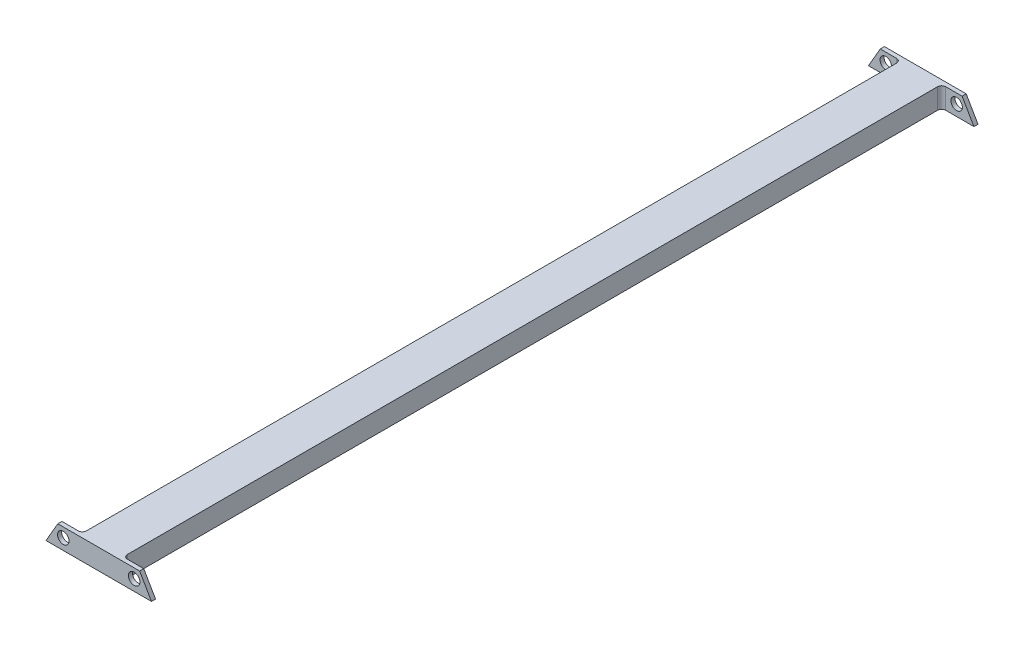
ISO-10303-21;
HEADER;
FILE_DESCRIPTION(('STEP AP214'),'2;1');
FILE_NAME('part.step','',(''),(''),'','','');
FILE_SCHEMA(('AUTOMOTIVE_DESIGN { 1 0 10303 214 1 1 1 1 }'));
ENDSEC;
DATA;
#1=APPLICATION_CONTEXT('core data for automotive mechanical design processes');
#2=APPLICATION_PROTOCOL_DEFINITION('international standard','automotive_design',2000,#1);
#3=PRODUCT_CONTEXT('',#1,'mechanical');
#4=PRODUCT('Part','Part','',(#3));
#5=PRODUCT_RELATED_PRODUCT_CATEGORY('part','',(#4));
#6=PRODUCT_DEFINITION_FORMATION('','',#4);
#7=PRODUCT_DEFINITION_CONTEXT('part definition',#1,'design');
#8=PRODUCT_DEFINITION('design','',#6,#7);
#9=PRODUCT_DEFINITION_SHAPE('','',#8);
#10=(LENGTH_UNIT() NAMED_UNIT(*) SI_UNIT(.MILLI.,.METRE.));
#11=(NAMED_UNIT(*) PLANE_ANGLE_UNIT() SI_UNIT($,.RADIAN.));
#12=(NAMED_UNIT(*) SI_UNIT($,.STERADIAN.) SOLID_ANGLE_UNIT());
#13=UNCERTAINTY_MEASURE_WITH_UNIT(LENGTH_MEASURE(1.E-05),#10,'distance_accuracy_value','');
#14=(GEOMETRIC_REPRESENTATION_CONTEXT(3) GLOBAL_UNCERTAINTY_ASSIGNED_CONTEXT((#13)) GLOBAL_UNIT_ASSIGNED_CONTEXT((#10,
#11,#12)) REPRESENTATION_CONTEXT('',''));
#15=CARTESIAN_POINT('',(0.,0.,0.));
#16=DIRECTION('',(0.,0.,1.));
#17=DIRECTION('',(1.,0.,0.));
#18=AXIS2_PLACEMENT_3D('',#15,#16,#17);
#19=CARTESIAN_POINT('',(0.,0.,5.));
#20=DIRECTION('',(0.,0.,-1.));
#21=DIRECTION('',(-1.,0.,0.));
#22=AXIS2_PLACEMENT_3D('',#19,#20,#21);
#23=PLANE('',#22);
#24=CARTESIAN_POINT('',(93.3012701892223,-11.6025403784439,5.));
#25=DIRECTION('',(0.,0.,1.));
#26=DIRECTION('',(1.,0.,0.));
#27=AXIS2_PLACEMENT_3D('',#24,#25,#26);
#28=CIRCLE('',#27,7.);
#29=CARTESIAN_POINT('',(100.301270189222,-11.6025403784439,5.));
#30=VERTEX_POINT('',#29);
#31=EDGE_CURVE('E188',#30,#30,#28,.T.);
#32=ORIENTED_EDGE('',*,*,#31,.F.);
#33=EDGE_LOOP('',(#32));
#34=FACE_BOUND('',#33,.T.);
#35=DIRECTION('',(-1.,0.,0.));
#36=VECTOR('',#35,1.);
#37=CARTESIAN_POINT('',(0.,0.,5.));
#38=LINE('',#37,#36);
#39=CARTESIAN_POINT('',(100.,0.,5.));
#40=VERTEX_POINT('',#39);
#41=CARTESIAN_POINT('',(80.,0.,5.));
#42=VERTEX_POINT('',#41);
#43=EDGE_CURVE('E205',#40,#42,#38,.T.);
#44=ORIENTED_EDGE('',*,*,#43,.T.);
#45=DIRECTION('',(0.,1.,0.));
#46=VECTOR('',#45,1.);
#47=CARTESIAN_POINT('',(80.,-25.,5.));
#48=LINE('',#47,#46);
#49=CARTESIAN_POINT('',(80.,-25.,5.));
#50=VERTEX_POINT('',#49);
#51=EDGE_CURVE('E240',#42,#50,#48,.F.);
#52=ORIENTED_EDGE('',*,*,#51,.T.);
#53=DIRECTION('',(1.,0.,0.));
#54=VECTOR('',#53,1.);
#55=CARTESIAN_POINT('',(114.433756729741,-25.,5.));
#56=LINE('',#55,#54);
#57=CARTESIAN_POINT('',(114.433756729741,-25.,5.));
#58=VERTEX_POINT('',#57);
#59=EDGE_CURVE('E197',#50,#58,#56,.T.);
#60=ORIENTED_EDGE('',*,*,#59,.T.);
#61=DIRECTION('',(-0.500000000000005,0.866025403784436,0.));
#62=VECTOR('',#61,1.);
#63=CARTESIAN_POINT('',(100.,0.,5.));
#64=LINE('',#63,#62);
#65=EDGE_CURVE('E202',#58,#40,#64,.T.);
#66=ORIENTED_EDGE('',*,*,#65,.T.);
#67=EDGE_LOOP('',(#44,#52,#60,#66));
#68=FACE_BOUND('',#67,.T.);
#69=ADVANCED_FACE('F32',(#34,#68),#23,.F.);
#70=CARTESIAN_POINT('',(6.69872981077774,-11.602540378444,5.));
#71=DIRECTION('',(0.,0.,1.));
#72=DIRECTION('',(1.,0.,0.));
#73=AXIS2_PLACEMENT_3D('',#70,#71,#72);
#74=CIRCLE('',#73,7.00000000000001);
#75=CARTESIAN_POINT('',(13.6987298107777,-11.602540378444,5.));
#76=VERTEX_POINT('',#75);
#77=EDGE_CURVE('E182',#76,#76,#74,.T.);
#78=ORIENTED_EDGE('',*,*,#77,.F.);
#79=EDGE_LOOP('',(#78));
#80=FACE_BOUND('',#79,.T.);
#81=CARTESIAN_POINT('',(-14.4337567297408,-25.,5.));
#82=VERTEX_POINT('',#81);
#83=CARTESIAN_POINT('',(20.,-25.,5.));
#84=VERTEX_POINT('',#83);
#85=EDGE_CURVE('E199',#82,#84,#56,.T.);
#86=ORIENTED_EDGE('',*,*,#85,.T.);
#87=DIRECTION('',(0.,-1.,0.));
#88=VECTOR('',#87,1.);
#89=CARTESIAN_POINT('',(20.,0.,5.));
#90=LINE('',#89,#88);
#91=CARTESIAN_POINT('',(20.,0.,5.));
#92=VERTEX_POINT('',#91);
#93=EDGE_CURVE('E230',#84,#92,#90,.F.);
#94=ORIENTED_EDGE('',*,*,#93,.T.);
#95=CARTESIAN_POINT('',(0.,0.,5.));
#96=VERTEX_POINT('',#95);
#97=EDGE_CURVE('E204',#92,#96,#38,.T.);
#98=ORIENTED_EDGE('',*,*,#97,.T.);
#99=DIRECTION('',(-0.500000000000004,-0.866025403784436,0.));
#100=VECTOR('',#99,1.);
#101=CARTESIAN_POINT('',(-14.4337567297408,-25.,5.));
#102=LINE('',#101,#100);
#103=EDGE_CURVE('E194',#96,#82,#102,.T.);
#104=ORIENTED_EDGE('',*,*,#103,.T.);
#105=EDGE_LOOP('',(#86,#94,#98,#104));
#106=FACE_BOUND('',#105,.T.);
#107=ADVANCED_FACE('F336',(#80,#106),#23,.F.);
#108=CARTESIAN_POINT('',(0.,0.,0.));
#109=DIRECTION('',(0.,0.,-1.));
#110=DIRECTION('',(-1.,0.,0.));
#111=AXIS2_PLACEMENT_3D('',#108,#109,#110);
#112=PLANE('',#111);
#113=CARTESIAN_POINT('',(93.3012701892223,-11.6025403784439,0.));
#114=DIRECTION('',(0.,0.,1.));
#115=DIRECTION('',(1.,0.,0.));
#116=AXIS2_PLACEMENT_3D('',#113,#114,#115);
#117=CIRCLE('',#116,7.);
#118=CARTESIAN_POINT('',(100.301270189222,-11.6025403784439,0.));
#119=VERTEX_POINT('',#118);
#120=EDGE_CURVE('E185',#119,#119,#117,.T.);
#121=ORIENTED_EDGE('',*,*,#120,.T.);
#122=EDGE_LOOP('',(#121));
#123=FACE_BOUND('',#122,.T.);
#124=DIRECTION('',(-0.500000000000004,-0.866025403784436,0.));
#125=VECTOR('',#124,1.);
#126=CARTESIAN_POINT('',(-14.4337567297408,-25.,0.));
#127=LINE('',#126,#125);
#128=CARTESIAN_POINT('',(0.,0.,0.));
#129=VERTEX_POINT('',#128);
#130=CARTESIAN_POINT('',(-14.4337567297408,-25.,0.));
#131=VERTEX_POINT('',#130);
#132=EDGE_CURVE('E191',#129,#131,#127,.T.);
#133=ORIENTED_EDGE('',*,*,#132,.F.);
#134=DIRECTION('',(-1.,0.,0.));
#135=VECTOR('',#134,1.);
#136=CARTESIAN_POINT('',(0.,0.,0.));
#137=LINE('',#136,#135);
#138=CARTESIAN_POINT('',(100.,0.,0.));
#139=VERTEX_POINT('',#138);
#140=EDGE_CURVE('E198',#139,#129,#137,.T.);
#141=ORIENTED_EDGE('',*,*,#140,.F.);
#142=DIRECTION('',(-0.500000000000005,0.866025403784436,0.));
#143=VECTOR('',#142,1.);
#144=CARTESIAN_POINT('',(100.,0.,0.));
#145=LINE('',#144,#143);
#146=CARTESIAN_POINT('',(114.433756729741,-25.,0.));
#147=VERTEX_POINT('',#146);
#148=EDGE_CURVE('E213',#147,#139,#145,.T.);
#149=ORIENTED_EDGE('',*,*,#148,.F.);
#150=DIRECTION('',(1.,0.,0.));
#151=VECTOR('',#150,1.);
#152=CARTESIAN_POINT('',(114.433756729741,-25.,0.));
#153=LINE('',#152,#151);
#154=EDGE_CURVE('E211',#131,#147,#153,.T.);
#155=ORIENTED_EDGE('',*,*,#154,.F.);
#156=EDGE_LOOP('',(#133,#141,#149,#155));
#157=FACE_BOUND('',#156,.T.);
#158=CARTESIAN_POINT('',(6.69872981077774,-11.602540378444,0.));
#159=DIRECTION('',(0.,0.,1.));
#160=DIRECTION('',(1.,0.,0.));
#161=AXIS2_PLACEMENT_3D('',#158,#159,#160);
#162=CIRCLE('',#161,7.00000000000001);
#163=CARTESIAN_POINT('',(13.6987298107777,-11.602540378444,0.));
#164=VERTEX_POINT('',#163);
#165=EDGE_CURVE('E181',#164,#164,#162,.T.);
#166=ORIENTED_EDGE('',*,*,#165,.T.);
#167=EDGE_LOOP('',(#166));
#168=FACE_BOUND('',#167,.T.);
#169=ADVANCED_FACE('F316',(#123,#157,#168),#112,.T.);
#170=CARTESIAN_POINT('',(-14.4337567297408,-25.,5.));
#171=DIRECTION('',(0.866025403784436,-0.500000000000004,0.));
#172=DIRECTION('',(0.500000000000004,0.866025403784437,0.));
#173=AXIS2_PLACEMENT_3D('',#170,#171,#172);
#174=PLANE('',#173);
#175=ORIENTED_EDGE('',*,*,#132,.T.);
#176=DIRECTION('',(0.,0.,-1.));
#177=VECTOR('',#176,1.);
#178=CARTESIAN_POINT('',(-14.4337567297408,-25.,5.));
#179=LINE('',#178,#177);
#180=EDGE_CURVE('E224',#82,#131,#179,.T.);
#181=ORIENTED_EDGE('',*,*,#180,.F.);
#182=ORIENTED_EDGE('',*,*,#103,.F.);
#183=DIRECTION('',(0.,0.,-1.));
#184=VECTOR('',#183,1.);
#185=CARTESIAN_POINT('',(0.,0.,5.));
#186=LINE('',#185,#184);
#187=EDGE_CURVE('E208',#96,#129,#186,.T.);
#188=ORIENTED_EDGE('',*,*,#187,.T.);
#189=EDGE_LOOP('',(#175,#181,#182,#188));
#190=FACE_BOUND('',#189,.T.);
#191=ADVANCED_FACE('F320',(#190),#174,.F.);
#192=CARTESIAN_POINT('',(114.433756729741,-25.,5.));
#193=DIRECTION('',(0.,1.,0.));
#194=DIRECTION('',(-1.,0.,0.));
#195=AXIS2_PLACEMENT_3D('',#192,#193,#194);
#196=PLANE('',#195);
#197=ORIENTED_EDGE('',*,*,#154,.T.);
#198=DIRECTION('',(0.,0.,-1.));
#199=VECTOR('',#198,1.);
#200=CARTESIAN_POINT('',(114.433756729741,-25.,5.));
#201=LINE('',#200,#199);
#202=EDGE_CURVE('E221',#58,#147,#201,.T.);
#203=ORIENTED_EDGE('',*,*,#202,.F.);
#204=ORIENTED_EDGE('',*,*,#59,.F.);
#205=CARTESIAN_POINT('',(80.,-25.,10.));
#206=DIRECTION('',(0.,1.,0.));
#207=DIRECTION('',(-1.,0.,0.));
#208=AXIS2_PLACEMENT_3D('',#205,#206,#207);
#209=CIRCLE('',#208,5.);
#210=CARTESIAN_POINT('',(75.,-25.,10.));
#211=VERTEX_POINT('',#210);
#212=EDGE_CURVE('E244',#50,#211,#209,.T.);
#213=ORIENTED_EDGE('',*,*,#212,.T.);
#214=DIRECTION('',(0.,0.,-1.));
#215=VECTOR('',#214,1.);
#216=CARTESIAN_POINT('',(75.,-25.,1005.));
#217=LINE('',#216,#215);
#218=CARTESIAN_POINT('',(75.,-25.,1000.));
#219=VERTEX_POINT('',#218);
#220=EDGE_CURVE('E168',#219,#211,#217,.T.);
#221=ORIENTED_EDGE('',*,*,#220,.F.);
#222=CARTESIAN_POINT('',(80.,-25.,1000.));
#223=DIRECTION('',(0.,1.,0.));
#224=DIRECTION('',(-1.,0.,0.));
#225=AXIS2_PLACEMENT_3D('',#222,#223,#224);
#226=CIRCLE('',#225,5.);
#227=CARTESIAN_POINT('',(80.,-25.,1005.));
#228=VERTEX_POINT('',#227);
#229=EDGE_CURVE('E254',#219,#228,#226,.T.);
#230=ORIENTED_EDGE('',*,*,#229,.T.);
#231=DIRECTION('',(1.,0.,0.));
#232=VECTOR('',#231,1.);
#233=CARTESIAN_POINT('',(75.,-25.,1005.));
#234=LINE('',#233,#232);
#235=CARTESIAN_POINT('',(114.433756729741,-25.,1005.));
#236=VERTEX_POINT('',#235);
#237=EDGE_CURVE('E268',#228,#236,#234,.T.);
#238=ORIENTED_EDGE('',*,*,#237,.T.);
#239=DIRECTION('',(0.,0.,-1.));
#240=VECTOR('',#239,1.);
#241=CARTESIAN_POINT('',(114.433756729741,-25.,1010.));
#242=LINE('',#241,#240);
#243=CARTESIAN_POINT('',(114.433756729741,-25.,1010.));
#244=VERTEX_POINT('',#243);
#245=EDGE_CURVE('E149',#244,#236,#242,.T.);
#246=ORIENTED_EDGE('',*,*,#245,.F.);
#247=DIRECTION('',(1.,0.,0.));
#248=VECTOR('',#247,1.);
#249=CARTESIAN_POINT('',(-14.4337567297408,-25.,1010.));
#250=LINE('',#249,#248);
#251=CARTESIAN_POINT('',(-14.4337567297408,-25.,1010.));
#252=VERTEX_POINT('',#251);
#253=EDGE_CURVE('E142',#252,#244,#250,.T.);
#254=ORIENTED_EDGE('',*,*,#253,.F.);
#255=DIRECTION('',(0.,0.,-1.));
#256=VECTOR('',#255,1.);
#257=CARTESIAN_POINT('',(-14.4337567297408,-25.,1010.));
#258=LINE('',#257,#256);
#259=CARTESIAN_POINT('',(-14.4337567297408,-25.,1005.));
#260=VERTEX_POINT('',#259);
#261=EDGE_CURVE('E146',#252,#260,#258,.T.);
#262=ORIENTED_EDGE('',*,*,#261,.T.);
#263=CARTESIAN_POINT('',(20.,-25.,1005.));
#264=VERTEX_POINT('',#263);
#265=EDGE_CURVE('E263',#260,#264,#234,.T.);
#266=ORIENTED_EDGE('',*,*,#265,.T.);
#267=CARTESIAN_POINT('',(20.,-25.,1000.));
#268=DIRECTION('',(0.,1.,0.));
#269=DIRECTION('',(-1.,0.,0.));
#270=AXIS2_PLACEMENT_3D('',#267,#268,#269);
#271=CIRCLE('',#270,5.);
#272=CARTESIAN_POINT('',(25.,-25.,1000.));
#273=VERTEX_POINT('',#272);
#274=EDGE_CURVE('E40',#264,#273,#271,.T.);
#275=ORIENTED_EDGE('',*,*,#274,.T.);
#276=DIRECTION('',(0.,0.,-1.));
#277=VECTOR('',#276,1.);
#278=CARTESIAN_POINT('',(25.,-25.,1005.));
#279=LINE('',#278,#277);
#280=CARTESIAN_POINT('',(25.,-25.,10.));
#281=VERTEX_POINT('',#280);
#282=EDGE_CURVE('E170',#273,#281,#279,.T.);
#283=ORIENTED_EDGE('',*,*,#282,.T.);
#284=CARTESIAN_POINT('',(20.,-25.,10.));
#285=DIRECTION('',(0.,1.,0.));
#286=DIRECTION('',(-1.,0.,0.));
#287=AXIS2_PLACEMENT_3D('',#284,#285,#286);
#288=CIRCLE('',#287,5.);
#289=EDGE_CURVE('E232',#281,#84,#288,.T.);
#290=ORIENTED_EDGE('',*,*,#289,.T.);
#291=ORIENTED_EDGE('',*,*,#85,.F.);
#292=ORIENTED_EDGE('',*,*,#180,.T.);
#293=EDGE_LOOP('',(#197,#203,#204,#213,#221,#230,#238,#246,#254,#262,#266,#275,#283,#290,#291,#292));
#294=FACE_BOUND('',#293,.T.);
#295=ADVANCED_FACE('F144',(#294),#196,.F.);
#296=CARTESIAN_POINT('',(100.,0.,5.));
#297=DIRECTION('',(-0.866025403784436,-0.500000000000005,0.));
#298=DIRECTION('',(0.500000000000005,-0.866025403784436,0.));
#299=AXIS2_PLACEMENT_3D('',#296,#297,#298);
#300=PLANE('',#299);
#301=ORIENTED_EDGE('',*,*,#148,.T.);
#302=DIRECTION('',(0.,0.,-1.));
#303=VECTOR('',#302,1.);
#304=CARTESIAN_POINT('',(100.,0.,5.));
#305=LINE('',#304,#303);
#306=EDGE_CURVE('E218',#40,#139,#305,.T.);
#307=ORIENTED_EDGE('',*,*,#306,.F.);
#308=ORIENTED_EDGE('',*,*,#65,.F.);
#309=ORIENTED_EDGE('',*,*,#202,.T.);
#310=EDGE_LOOP('',(#301,#307,#308,#309));
#311=FACE_BOUND('',#310,.T.);
#312=ADVANCED_FACE('F310',(#311),#300,.F.);
#313=CARTESIAN_POINT('',(0.,0.,5.));
#314=DIRECTION('',(0.,-1.,0.));
#315=DIRECTION('',(0.,0.,-1.));
#316=AXIS2_PLACEMENT_3D('',#313,#314,#315);
#317=PLANE('',#316);
#318=ORIENTED_EDGE('',*,*,#140,.T.);
#319=ORIENTED_EDGE('',*,*,#187,.F.);
#320=ORIENTED_EDGE('',*,*,#97,.F.);
#321=CARTESIAN_POINT('',(20.,0.,10.));
#322=DIRECTION('',(0.,-1.,0.));
#323=DIRECTION('',(0.,0.,-1.));
#324=AXIS2_PLACEMENT_3D('',#321,#322,#323);
#325=CIRCLE('',#324,5.);
#326=CARTESIAN_POINT('',(25.,0.,10.));
#327=VERTEX_POINT('',#326);
#328=EDGE_CURVE('E234',#92,#327,#325,.T.);
#329=ORIENTED_EDGE('',*,*,#328,.T.);
#330=DIRECTION('',(0.,0.,-1.));
#331=VECTOR('',#330,1.);
#332=CARTESIAN_POINT('',(25.,0.,1005.));
#333=LINE('',#332,#331);
#334=CARTESIAN_POINT('',(25.,0.,1000.));
#335=VERTEX_POINT('',#334);
#336=EDGE_CURVE('E177',#335,#327,#333,.T.);
#337=ORIENTED_EDGE('',*,*,#336,.F.);
#338=CARTESIAN_POINT('',(20.,0.,1000.));
#339=DIRECTION('',(0.,-1.,0.));
#340=DIRECTION('',(0.,0.,-1.));
#341=AXIS2_PLACEMENT_3D('',#338,#339,#340);
#342=CIRCLE('',#341,5.);
#343=CARTESIAN_POINT('',(20.,0.,1005.));
#344=VERTEX_POINT('',#343);
#345=EDGE_CURVE('E11',#335,#344,#342,.T.);
#346=ORIENTED_EDGE('',*,*,#345,.T.);
#347=DIRECTION('',(-1.,0.,0.));
#348=VECTOR('',#347,1.);
#349=CARTESIAN_POINT('',(25.,0.,1005.));
#350=LINE('',#349,#348);
#351=CARTESIAN_POINT('',(0.,0.,1005.));
#352=VERTEX_POINT('',#351);
#353=EDGE_CURVE('E264',#344,#352,#350,.T.);
#354=ORIENTED_EDGE('',*,*,#353,.T.);
#355=DIRECTION('',(0.,0.,-1.));
#356=VECTOR('',#355,1.);
#357=CARTESIAN_POINT('',(0.,0.,1010.));
#358=LINE('',#357,#356);
#359=CARTESIAN_POINT('',(0.,0.,1010.));
#360=VERTEX_POINT('',#359);
#361=EDGE_CURVE('E277',#360,#352,#358,.T.);
#362=ORIENTED_EDGE('',*,*,#361,.F.);
#363=DIRECTION('',(-1.,0.,0.));
#364=VECTOR('',#363,1.);
#365=CARTESIAN_POINT('',(100.,0.,1010.));
#366=LINE('',#365,#364);
#367=CARTESIAN_POINT('',(100.,0.,1010.));
#368=VERTEX_POINT('',#367);
#369=EDGE_CURVE('E159',#368,#360,#366,.T.);
#370=ORIENTED_EDGE('',*,*,#369,.F.);
#371=DIRECTION('',(0.,0.,-1.));
#372=VECTOR('',#371,1.);
#373=CARTESIAN_POINT('',(100.,0.,1010.));
#374=LINE('',#373,#372);
#375=CARTESIAN_POINT('',(100.,0.,1005.));
#376=VERTEX_POINT('',#375);
#377=EDGE_CURVE('E172',#368,#376,#374,.T.);
#378=ORIENTED_EDGE('',*,*,#377,.T.);
#379=CARTESIAN_POINT('',(80.,0.,1005.));
#380=VERTEX_POINT('',#379);
#381=EDGE_CURVE('E163',#376,#380,#350,.T.);
#382=ORIENTED_EDGE('',*,*,#381,.T.);
#383=CARTESIAN_POINT('',(80.,0.,1000.));
#384=DIRECTION('',(0.,-1.,0.));
#385=DIRECTION('',(0.,0.,-1.));
#386=AXIS2_PLACEMENT_3D('',#383,#384,#385);
#387=CIRCLE('',#386,5.);
#388=CARTESIAN_POINT('',(75.,0.,1000.));
#389=VERTEX_POINT('',#388);
#390=EDGE_CURVE('E252',#380,#389,#387,.T.);
#391=ORIENTED_EDGE('',*,*,#390,.T.);
#392=DIRECTION('',(0.,0.,-1.));
#393=VECTOR('',#392,1.);
#394=CARTESIAN_POINT('',(75.,0.,1005.));
#395=LINE('',#394,#393);
#396=CARTESIAN_POINT('',(75.,0.,10.));
#397=VERTEX_POINT('',#396);
#398=EDGE_CURVE('E179',#389,#397,#395,.T.);
#399=ORIENTED_EDGE('',*,*,#398,.T.);
#400=CARTESIAN_POINT('',(80.,0.,10.));
#401=DIRECTION('',(0.,-1.,0.));
#402=DIRECTION('',(0.,0.,-1.));
#403=AXIS2_PLACEMENT_3D('',#400,#401,#402);
#404=CIRCLE('',#403,5.);
#405=EDGE_CURVE('E242',#397,#42,#404,.T.);
#406=ORIENTED_EDGE('',*,*,#405,.T.);
#407=ORIENTED_EDGE('',*,*,#43,.F.);
#408=ORIENTED_EDGE('',*,*,#306,.T.);
#409=EDGE_LOOP('',(#318,#319,#320,#329,#337,#346,#354,#362,#370,#378,#382,#391,#399,#406,#407,#408));
#410=FACE_BOUND('',#409,.T.);
#411=ADVANCED_FACE('F281',(#410),#317,.F.);
#412=CARTESIAN_POINT('',(93.3012701892223,-11.6025403784439,5.));
#413=DIRECTION('',(0.,0.,-1.));
#414=DIRECTION('',(-1.,0.,0.));
#415=AXIS2_PLACEMENT_3D('',#412,#413,#414);
#416=CYLINDRICAL_SURFACE('',#415,7.);
#417=ORIENTED_EDGE('',*,*,#31,.T.);
#418=EDGE_LOOP('',(#417));
#419=FACE_BOUND('',#418,.T.);
#420=ORIENTED_EDGE('',*,*,#120,.F.);
#421=EDGE_LOOP('',(#420));
#422=FACE_BOUND('',#421,.T.);
#423=ADVANCED_FACE('F346',(#419,#422),#416,.F.);
#424=CARTESIAN_POINT('',(6.69872981077774,-11.602540378444,5.));
#425=DIRECTION('',(0.,0.,-1.));
#426=DIRECTION('',(-1.,0.,0.));
#427=AXIS2_PLACEMENT_3D('',#424,#425,#426);
#428=CYLINDRICAL_SURFACE('',#427,7.00000000000001);
#429=ORIENTED_EDGE('',*,*,#77,.T.);
#430=EDGE_LOOP('',(#429));
#431=FACE_BOUND('',#430,.T.);
#432=ORIENTED_EDGE('',*,*,#165,.F.);
#433=EDGE_LOOP('',(#432));
#434=FACE_BOUND('',#433,.T.);
#435=ADVANCED_FACE('F494',(#431,#434),#428,.F.);
#436=CARTESIAN_POINT('',(75.,-25.,1005.));
#437=DIRECTION('',(-1.,0.,0.));
#438=DIRECTION('',(0.,0.,1.));
#439=AXIS2_PLACEMENT_3D('',#436,#437,#438);
#440=PLANE('',#439);
#441=ORIENTED_EDGE('',*,*,#398,.F.);
#442=DIRECTION('',(0.,1.,0.));
#443=VECTOR('',#442,1.);
#444=CARTESIAN_POINT('',(75.,-25.,1000.));
#445=LINE('',#444,#443);
#446=EDGE_CURVE('E250',#389,#219,#445,.F.);
#447=ORIENTED_EDGE('',*,*,#446,.T.);
#448=ORIENTED_EDGE('',*,*,#220,.T.);
#449=DIRECTION('',(0.,1.,0.));
#450=VECTOR('',#449,1.);
#451=CARTESIAN_POINT('',(75.,0.,10.));
#452=LINE('',#451,#450);
#453=EDGE_CURVE('E237',#211,#397,#452,.T.);
#454=ORIENTED_EDGE('',*,*,#453,.T.);
#455=EDGE_LOOP('',(#441,#447,#448,#454));
#456=FACE_BOUND('',#455,.T.);
#457=ADVANCED_FACE('F296',(#456),#440,.F.);
#458=CARTESIAN_POINT('',(25.,-25.,1005.));
#459=DIRECTION('',(1.,0.,0.));
#460=DIRECTION('',(0.,0.,-1.));
#461=AXIS2_PLACEMENT_3D('',#458,#459,#460);
#462=PLANE('',#461);
#463=ORIENTED_EDGE('',*,*,#282,.F.);
#464=DIRECTION('',(0.,-1.,0.));
#465=VECTOR('',#464,1.);
#466=CARTESIAN_POINT('',(25.,0.,1000.));
#467=LINE('',#466,#465);
#468=EDGE_CURVE('E53',#273,#335,#467,.F.);
#469=ORIENTED_EDGE('',*,*,#468,.T.);
#470=ORIENTED_EDGE('',*,*,#336,.T.);
#471=DIRECTION('',(0.,-1.,0.));
#472=VECTOR('',#471,1.);
#473=CARTESIAN_POINT('',(25.,-25.,10.));
#474=LINE('',#473,#472);
#475=EDGE_CURVE('E227',#327,#281,#474,.T.);
#476=ORIENTED_EDGE('',*,*,#475,.T.);
#477=EDGE_LOOP('',(#463,#469,#470,#476));
#478=FACE_BOUND('',#477,.T.);
#479=ADVANCED_FACE('F330',(#478),#462,.F.);
#480=CARTESIAN_POINT('',(0.,0.,1005.));
#481=DIRECTION('',(0.,0.,1.));
#482=DIRECTION('',(1.,0.,0.));
#483=AXIS2_PLACEMENT_3D('',#480,#481,#482);
#484=PLANE('',#483);
#485=CARTESIAN_POINT('',(93.3012701892223,-11.6025403784439,1005.));
#486=DIRECTION('',(0.,0.,1.));
#487=DIRECTION('',(1.,0.,0.));
#488=AXIS2_PLACEMENT_3D('',#485,#486,#487);
#489=CIRCLE('',#488,7.);
#490=CARTESIAN_POINT('',(100.301270189222,-11.6025403784439,1005.));
#491=VERTEX_POINT('',#490);
#492=EDGE_CURVE('E532',#491,#491,#489,.T.);
#493=ORIENTED_EDGE('',*,*,#492,.T.);
#494=EDGE_LOOP('',(#493));
#495=FACE_BOUND('',#494,.T.);
#496=ORIENTED_EDGE('',*,*,#237,.F.);
#497=DIRECTION('',(0.,1.,0.));
#498=VECTOR('',#497,1.);
#499=CARTESIAN_POINT('',(80.,0.,1005.));
#500=LINE('',#499,#498);
#501=EDGE_CURVE('E247',#228,#380,#500,.T.);
#502=ORIENTED_EDGE('',*,*,#501,.T.);
#503=ORIENTED_EDGE('',*,*,#381,.F.);
#504=DIRECTION('',(-0.500000000000005,0.866025403784436,0.));
#505=VECTOR('',#504,1.);
#506=CARTESIAN_POINT('',(114.433756729741,-25.,1005.));
#507=LINE('',#506,#505);
#508=EDGE_CURVE('E267',#236,#376,#507,.T.);
#509=ORIENTED_EDGE('',*,*,#508,.F.);
#510=EDGE_LOOP('',(#496,#502,#503,#509));
#511=FACE_BOUND('',#510,.T.);
#512=ADVANCED_FACE('F287',(#495,#511),#484,.F.);
#513=CARTESIAN_POINT('',(6.69872981077774,-11.602540378444,1005.));
#514=DIRECTION('',(0.,0.,1.));
#515=DIRECTION('',(1.,0.,0.));
#516=AXIS2_PLACEMENT_3D('',#513,#514,#515);
#517=CIRCLE('',#516,7.00000000000001);
#518=CARTESIAN_POINT('',(13.6987298107777,-11.602540378444,1005.));
#519=VERTEX_POINT('',#518);
#520=EDGE_CURVE('E540',#519,#519,#517,.T.);
#521=ORIENTED_EDGE('',*,*,#520,.T.);
#522=EDGE_LOOP('',(#521));
#523=FACE_BOUND('',#522,.T.);
#524=ORIENTED_EDGE('',*,*,#353,.F.);
#525=DIRECTION('',(0.,-1.,0.));
#526=VECTOR('',#525,1.);
#527=CARTESIAN_POINT('',(20.,-25.,1005.));
#528=LINE('',#527,#526);
#529=EDGE_CURVE('E256',#344,#264,#528,.T.);
#530=ORIENTED_EDGE('',*,*,#529,.T.);
#531=ORIENTED_EDGE('',*,*,#265,.F.);
#532=DIRECTION('',(-0.500000000000004,-0.866025403784436,0.));
#533=VECTOR('',#532,1.);
#534=CARTESIAN_POINT('',(0.,0.,1005.));
#535=LINE('',#534,#533);
#536=EDGE_CURVE('E167',#352,#260,#535,.T.);
#537=ORIENTED_EDGE('',*,*,#536,.F.);
#538=EDGE_LOOP('',(#524,#530,#531,#537));
#539=FACE_BOUND('',#538,.T.);
#540=ADVANCED_FACE('F262',(#523,#539),#484,.F.);
#541=CARTESIAN_POINT('',(0.,0.,1010.));
#542=DIRECTION('',(0.,0.,1.));
#543=DIRECTION('',(1.,0.,0.));
#544=AXIS2_PLACEMENT_3D('',#541,#542,#543);
#545=PLANE('',#544);
#546=CARTESIAN_POINT('',(93.3012701892223,-11.6025403784439,1010.));
#547=DIRECTION('',(0.,0.,1.));
#548=DIRECTION('',(1.,0.,0.));
#549=AXIS2_PLACEMENT_3D('',#546,#547,#548);
#550=CIRCLE('',#549,7.);
#551=CARTESIAN_POINT('',(100.301270189222,-11.6025403784439,1010.));
#552=VERTEX_POINT('',#551);
#553=EDGE_CURVE('E534',#552,#552,#550,.T.);
#554=ORIENTED_EDGE('',*,*,#553,.F.);
#555=EDGE_LOOP('',(#554));
#556=FACE_BOUND('',#555,.T.);
#557=DIRECTION('',(-0.500000000000004,-0.866025403784436,0.));
#558=VECTOR('',#557,1.);
#559=CARTESIAN_POINT('',(0.,0.,1010.));
#560=LINE('',#559,#558);
#561=EDGE_CURVE('E153',#360,#252,#560,.T.);
#562=ORIENTED_EDGE('',*,*,#561,.T.);
#563=ORIENTED_EDGE('',*,*,#253,.T.);
#564=DIRECTION('',(-0.500000000000005,0.866025403784436,0.));
#565=VECTOR('',#564,1.);
#566=CARTESIAN_POINT('',(114.433756729741,-25.,1010.));
#567=LINE('',#566,#565);
#568=EDGE_CURVE('E152',#244,#368,#567,.T.);
#569=ORIENTED_EDGE('',*,*,#568,.T.);
#570=ORIENTED_EDGE('',*,*,#369,.T.);
#571=EDGE_LOOP('',(#562,#563,#569,#570));
#572=FACE_BOUND('',#571,.T.);
#573=CARTESIAN_POINT('',(6.69872981077774,-11.602540378444,1010.));
#574=DIRECTION('',(0.,0.,1.));
#575=DIRECTION('',(1.,0.,0.));
#576=AXIS2_PLACEMENT_3D('',#573,#574,#575);
#577=CIRCLE('',#576,7.00000000000001);
#578=CARTESIAN_POINT('',(13.6987298107777,-11.602540378444,1010.));
#579=VERTEX_POINT('',#578);
#580=EDGE_CURVE('E535',#579,#579,#577,.T.);
#581=ORIENTED_EDGE('',*,*,#580,.F.);
#582=EDGE_LOOP('',(#581));
#583=FACE_BOUND('',#582,.T.);
#584=ADVANCED_FACE('F156',(#556,#572,#583),#545,.T.);
#585=CARTESIAN_POINT('',(0.,0.,1010.));
#586=DIRECTION('',(0.866025403784436,-0.500000000000004,0.));
#587=DIRECTION('',(0.500000000000004,0.866025403784437,0.));
#588=AXIS2_PLACEMENT_3D('',#585,#586,#587);
#589=PLANE('',#588);
#590=ORIENTED_EDGE('',*,*,#536,.T.);
#591=ORIENTED_EDGE('',*,*,#261,.F.);
#592=ORIENTED_EDGE('',*,*,#561,.F.);
#593=ORIENTED_EDGE('',*,*,#361,.T.);
#594=EDGE_LOOP('',(#590,#591,#592,#593));
#595=FACE_BOUND('',#594,.T.);
#596=ADVANCED_FACE('F165',(#595),#589,.F.);
#597=CARTESIAN_POINT('',(114.433756729741,-25.,1010.));
#598=DIRECTION('',(-0.866025403784436,-0.500000000000005,0.));
#599=DIRECTION('',(0.500000000000005,-0.866025403784436,0.));
#600=AXIS2_PLACEMENT_3D('',#597,#598,#599);
#601=PLANE('',#600);
#602=ORIENTED_EDGE('',*,*,#508,.T.);
#603=ORIENTED_EDGE('',*,*,#377,.F.);
#604=ORIENTED_EDGE('',*,*,#568,.F.);
#605=ORIENTED_EDGE('',*,*,#245,.T.);
#606=EDGE_LOOP('',(#602,#603,#604,#605));
#607=FACE_BOUND('',#606,.T.);
#608=ADVANCED_FACE('F283',(#607),#601,.F.);
#609=CARTESIAN_POINT('',(93.3012701892223,-11.6025403784439,1010.));
#610=DIRECTION('',(0.,0.,-1.));
#611=DIRECTION('',(-1.,0.,0.));
#612=AXIS2_PLACEMENT_3D('',#609,#610,#611);
#613=CYLINDRICAL_SURFACE('',#612,7.);
#614=ORIENTED_EDGE('',*,*,#553,.T.);
#615=EDGE_LOOP('',(#614));
#616=FACE_BOUND('',#615,.T.);
#617=ORIENTED_EDGE('',*,*,#492,.F.);
#618=EDGE_LOOP('',(#617));
#619=FACE_BOUND('',#618,.T.);
#620=ADVANCED_FACE('F440',(#616,#619),#613,.F.);
#621=CARTESIAN_POINT('',(6.69872981077774,-11.602540378444,1010.));
#622=DIRECTION('',(0.,0.,-1.));
#623=DIRECTION('',(-1.,0.,0.));
#624=AXIS2_PLACEMENT_3D('',#621,#622,#623);
#625=CYLINDRICAL_SURFACE('',#624,7.00000000000001);
#626=ORIENTED_EDGE('',*,*,#580,.T.);
#627=EDGE_LOOP('',(#626));
#628=FACE_BOUND('',#627,.T.);
#629=ORIENTED_EDGE('',*,*,#520,.F.);
#630=EDGE_LOOP('',(#629));
#631=FACE_BOUND('',#630,.T.);
#632=ADVANCED_FACE('F361',(#628,#631),#625,.F.);
#633=CARTESIAN_POINT('',(20.,-25.,10.));
#634=DIRECTION('',(0.,1.,0.));
#635=DIRECTION('',(0.,0.,1.));
#636=AXIS2_PLACEMENT_3D('',#633,#634,#635);
#637=CYLINDRICAL_SURFACE('',#636,5.);
#638=ORIENTED_EDGE('',*,*,#328,.F.);
#639=ORIENTED_EDGE('',*,*,#93,.F.);
#640=ORIENTED_EDGE('',*,*,#289,.F.);
#641=ORIENTED_EDGE('',*,*,#475,.F.);
#642=EDGE_LOOP('',(#638,#639,#640,#641));
#643=FACE_BOUND('',#642,.T.);
#644=ADVANCED_FACE('F328',(#643),#637,.F.);
#645=CARTESIAN_POINT('',(80.,-25.,10.));
#646=DIRECTION('',(0.,-1.,0.));
#647=DIRECTION('',(0.,0.,-1.));
#648=AXIS2_PLACEMENT_3D('',#645,#646,#647);
#649=CYLINDRICAL_SURFACE('',#648,5.);
#650=ORIENTED_EDGE('',*,*,#212,.F.);
#651=ORIENTED_EDGE('',*,*,#51,.F.);
#652=ORIENTED_EDGE('',*,*,#405,.F.);
#653=ORIENTED_EDGE('',*,*,#453,.F.);
#654=EDGE_LOOP('',(#650,#651,#652,#653));
#655=FACE_BOUND('',#654,.T.);
#656=ADVANCED_FACE('F301',(#655),#649,.F.);
#657=CARTESIAN_POINT('',(80.,0.,1000.));
#658=DIRECTION('',(0.,-1.,0.));
#659=DIRECTION('',(0.,0.,-1.));
#660=AXIS2_PLACEMENT_3D('',#657,#658,#659);
#661=CYLINDRICAL_SURFACE('',#660,5.);
#662=ORIENTED_EDGE('',*,*,#229,.F.);
#663=ORIENTED_EDGE('',*,*,#446,.F.);
#664=ORIENTED_EDGE('',*,*,#390,.F.);
#665=ORIENTED_EDGE('',*,*,#501,.F.);
#666=EDGE_LOOP('',(#662,#663,#664,#665));
#667=FACE_BOUND('',#666,.T.);
#668=ADVANCED_FACE('F291',(#667),#661,.F.);
#669=CARTESIAN_POINT('',(20.,0.,1000.));
#670=DIRECTION('',(0.,1.,0.));
#671=DIRECTION('',(0.,0.,1.));
#672=AXIS2_PLACEMENT_3D('',#669,#670,#671);
#673=CYLINDRICAL_SURFACE('',#672,5.);
#674=ORIENTED_EDGE('',*,*,#345,.F.);
#675=ORIENTED_EDGE('',*,*,#468,.F.);
#676=ORIENTED_EDGE('',*,*,#274,.F.);
#677=ORIENTED_EDGE('',*,*,#529,.F.);
#678=EDGE_LOOP('',(#674,#675,#676,#677));
#679=FACE_BOUND('',#678,.T.);
#680=ADVANCED_FACE('F34',(#679),#673,.F.);
#681=CLOSED_SHELL('',(#69,#107,#169,#191,#295,#312,#411,#423,#435,#457,#479,#512,#540,#584,#596,
#608,#620,#632,#644,#656,#668,#680));
#682=MANIFOLD_SOLID_BREP('B2',#681);
#683=ADVANCED_BREP_SHAPE_REPRESENTATION('',(#18,#682),#14);
#684=SHAPE_DEFINITION_REPRESENTATION(#9,#683);
ENDSEC;
END-ISO-10303-21;
